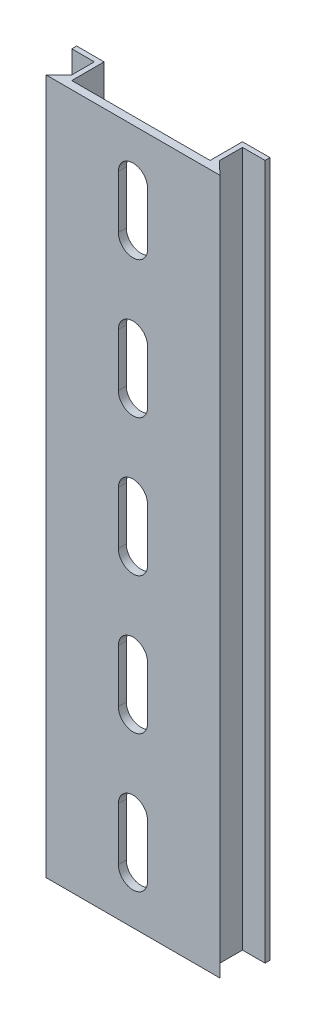
ISO-10303-21;
HEADER;
FILE_DESCRIPTION(('STEP AP214'),'2;1');
FILE_NAME('part.step','',(''),(''),'','','');
FILE_SCHEMA(('AUTOMOTIVE_DESIGN { 1 0 10303 214 1 1 1 1 }'));
ENDSEC;
DATA;
#1=APPLICATION_CONTEXT('core data for automotive mechanical design processes');
#2=APPLICATION_PROTOCOL_DEFINITION('international standard','automotive_design',2000,#1);
#3=PRODUCT_CONTEXT('',#1,'mechanical');
#4=PRODUCT('Part','Part','',(#3));
#5=PRODUCT_RELATED_PRODUCT_CATEGORY('part','',(#4));
#6=PRODUCT_DEFINITION_FORMATION('','',#4);
#7=PRODUCT_DEFINITION_CONTEXT('part definition',#1,'design');
#8=PRODUCT_DEFINITION('design','',#6,#7);
#9=PRODUCT_DEFINITION_SHAPE('','',#8);
#10=(LENGTH_UNIT() NAMED_UNIT(*) SI_UNIT(.MILLI.,.METRE.));
#11=(NAMED_UNIT(*) PLANE_ANGLE_UNIT() SI_UNIT($,.RADIAN.));
#12=(NAMED_UNIT(*) SI_UNIT($,.STERADIAN.) SOLID_ANGLE_UNIT());
#13=UNCERTAINTY_MEASURE_WITH_UNIT(LENGTH_MEASURE(1.E-05),#10,'distance_accuracy_value','');
#14=(GEOMETRIC_REPRESENTATION_CONTEXT(3) GLOBAL_UNCERTAINTY_ASSIGNED_CONTEXT((#13)) GLOBAL_UNIT_ASSIGNED_CONTEXT((#10,
#11,#12)) REPRESENTATION_CONTEXT('',''));
#15=CARTESIAN_POINT('',(0.,0.,0.));
#16=DIRECTION('',(0.,0.,1.));
#17=DIRECTION('',(1.,0.,0.));
#18=AXIS2_PLACEMENT_3D('',#15,#16,#17);
#19=CARTESIAN_POINT('',(0.,63.5,-1.4478));
#20=DIRECTION('',(0.,0.,-1.));
#21=DIRECTION('',(-1.,0.,0.));
#22=AXIS2_PLACEMENT_3D('',#19,#20,#21);
#23=PLANE('',#22);
#24=CARTESIAN_POINT('',(0.,-54.833,-1.4478));
#25=DIRECTION('',(0.,0.,-1.));
#26=DIRECTION('',(-1.,0.,0.));
#27=AXIS2_PLACEMENT_3D('',#24,#25,#26);
#28=CIRCLE('',#27,2.667);
#29=CARTESIAN_POINT('',(2.667,-54.833,-1.4478));
#30=VERTEX_POINT('',#29);
#31=CARTESIAN_POINT('',(-2.667,-54.833,-1.4478));
#32=VERTEX_POINT('',#31);
#33=EDGE_CURVE('E271',#30,#32,#28,.T.);
#34=ORIENTED_EDGE('',*,*,#33,.F.);
#35=DIRECTION('',(0.,-1.,0.));
#36=VECTOR('',#35,1.);
#37=CARTESIAN_POINT('',(2.667,13.5,-1.4478));
#38=LINE('',#37,#36);
#39=CARTESIAN_POINT('',(2.667,-45.167,-1.4478));
#40=VERTEX_POINT('',#39);
#41=EDGE_CURVE('E256',#40,#30,#38,.T.);
#42=ORIENTED_EDGE('',*,*,#41,.F.);
#43=CARTESIAN_POINT('',(0.,-45.167,-1.4478));
#44=DIRECTION('',(0.,0.,-1.));
#45=DIRECTION('',(-1.,0.,0.));
#46=AXIS2_PLACEMENT_3D('',#43,#44,#45);
#47=CIRCLE('',#46,2.667);
#48=CARTESIAN_POINT('',(-2.667,-45.167,-1.4478));
#49=VERTEX_POINT('',#48);
#50=EDGE_CURVE('E49',#49,#40,#47,.T.);
#51=ORIENTED_EDGE('',*,*,#50,.F.);
#52=DIRECTION('',(0.,1.,0.));
#53=VECTOR('',#52,1.);
#54=CARTESIAN_POINT('',(-2.667,13.5,-1.4478));
#55=LINE('',#54,#53);
#56=EDGE_CURVE('E278',#32,#49,#55,.T.);
#57=ORIENTED_EDGE('',*,*,#56,.F.);
#58=EDGE_LOOP('',(#34,#42,#51,#57));
#59=FACE_BOUND('',#58,.T.);
#60=CARTESIAN_POINT('',(0.,20.167,-1.4478));
#61=DIRECTION('',(0.,0.,-1.));
#62=DIRECTION('',(-1.,0.,0.));
#63=AXIS2_PLACEMENT_3D('',#60,#61,#62);
#64=CIRCLE('',#63,2.667);
#65=CARTESIAN_POINT('',(2.667,20.167,-1.4478));
#66=VERTEX_POINT('',#65);
#67=CARTESIAN_POINT('',(-2.667,20.167,-1.4478));
#68=VERTEX_POINT('',#67);
#69=EDGE_CURVE('E311',#66,#68,#64,.T.);
#70=ORIENTED_EDGE('',*,*,#69,.F.);
#71=DIRECTION('',(0.,-1.,0.));
#72=VECTOR('',#71,1.);
#73=CARTESIAN_POINT('',(2.667,88.5,-1.4478));
#74=LINE('',#73,#72);
#75=CARTESIAN_POINT('',(2.667,29.833,-1.4478));
#76=VERTEX_POINT('',#75);
#77=EDGE_CURVE('E287',#76,#66,#74,.T.);
#78=ORIENTED_EDGE('',*,*,#77,.F.);
#79=CARTESIAN_POINT('',(0.,29.833,-1.4478));
#80=DIRECTION('',(0.,0.,-1.));
#81=DIRECTION('',(-1.,0.,0.));
#82=AXIS2_PLACEMENT_3D('',#79,#80,#81);
#83=CIRCLE('',#82,2.667);
#84=CARTESIAN_POINT('',(-2.667,29.833,-1.4478));
#85=VERTEX_POINT('',#84);
#86=EDGE_CURVE('E57',#85,#76,#83,.T.);
#87=ORIENTED_EDGE('',*,*,#86,.F.);
#88=DIRECTION('',(0.,1.,0.));
#89=VECTOR('',#88,1.);
#90=CARTESIAN_POINT('',(-2.667,88.5,-1.4478));
#91=LINE('',#90,#89);
#92=EDGE_CURVE('E303',#68,#85,#91,.T.);
#93=ORIENTED_EDGE('',*,*,#92,.F.);
#94=EDGE_LOOP('',(#70,#78,#87,#93));
#95=FACE_BOUND('',#94,.T.);
#96=CARTESIAN_POINT('',(0.,45.167,-1.4478));
#97=DIRECTION('',(0.,0.,-1.));
#98=DIRECTION('',(-1.,0.,0.));
#99=AXIS2_PLACEMENT_3D('',#96,#97,#98);
#100=CIRCLE('',#99,2.667);
#101=CARTESIAN_POINT('',(2.667,45.167,-1.4478));
#102=VERTEX_POINT('',#101);
#103=CARTESIAN_POINT('',(-2.667,45.167,-1.4478));
#104=VERTEX_POINT('',#103);
#105=EDGE_CURVE('E340',#102,#104,#100,.T.);
#106=ORIENTED_EDGE('',*,*,#105,.F.);
#107=DIRECTION('',(0.,-1.,0.));
#108=VECTOR('',#107,1.);
#109=CARTESIAN_POINT('',(2.667,113.5,-1.4478));
#110=LINE('',#109,#108);
#111=CARTESIAN_POINT('',(2.667,54.833,-1.4478));
#112=VERTEX_POINT('',#111);
#113=EDGE_CURVE('E315',#112,#102,#110,.T.);
#114=ORIENTED_EDGE('',*,*,#113,.F.);
#115=CARTESIAN_POINT('',(0.,54.833,-1.4478));
#116=DIRECTION('',(0.,0.,-1.));
#117=DIRECTION('',(-1.,0.,0.));
#118=AXIS2_PLACEMENT_3D('',#115,#116,#117);
#119=CIRCLE('',#118,2.667);
#120=CARTESIAN_POINT('',(-2.667,54.833,-1.4478));
#121=VERTEX_POINT('',#120);
#122=EDGE_CURVE('E325',#121,#112,#119,.T.);
#123=ORIENTED_EDGE('',*,*,#122,.F.);
#124=DIRECTION('',(0.,1.,0.));
#125=VECTOR('',#124,1.);
#126=CARTESIAN_POINT('',(-2.667,113.5,-1.4478));
#127=LINE('',#126,#125);
#128=EDGE_CURVE('E332',#104,#121,#127,.T.);
#129=ORIENTED_EDGE('',*,*,#128,.F.);
#130=EDGE_LOOP('',(#106,#114,#123,#129));
#131=FACE_BOUND('',#130,.T.);
#132=CARTESIAN_POINT('',(0.,-29.833,-1.4478));
#133=DIRECTION('',(0.,0.,-1.));
#134=DIRECTION('',(-1.,0.,0.));
#135=AXIS2_PLACEMENT_3D('',#132,#133,#134);
#136=CIRCLE('',#135,2.667);
#137=CARTESIAN_POINT('',(2.667,-29.833,-1.4478));
#138=VERTEX_POINT('',#137);
#139=CARTESIAN_POINT('',(-2.667,-29.833,-1.4478));
#140=VERTEX_POINT('',#139);
#141=EDGE_CURVE('E368',#138,#140,#136,.T.);
#142=ORIENTED_EDGE('',*,*,#141,.F.);
#143=DIRECTION('',(0.,-1.,0.));
#144=VECTOR('',#143,1.);
#145=CARTESIAN_POINT('',(2.667,38.5,-1.4478));
#146=LINE('',#145,#144);
#147=CARTESIAN_POINT('',(2.667,-20.167,-1.4478));
#148=VERTEX_POINT('',#147);
#149=EDGE_CURVE('E281',#148,#138,#146,.T.);
#150=ORIENTED_EDGE('',*,*,#149,.F.);
#151=CARTESIAN_POINT('',(0.,-20.167,-1.4478));
#152=DIRECTION('',(0.,0.,-1.));
#153=DIRECTION('',(-1.,0.,0.));
#154=AXIS2_PLACEMENT_3D('',#151,#152,#153);
#155=CIRCLE('',#154,2.667);
#156=CARTESIAN_POINT('',(-2.667,-20.167,-1.4478));
#157=VERTEX_POINT('',#156);
#158=EDGE_CURVE('E353',#157,#148,#155,.T.);
#159=ORIENTED_EDGE('',*,*,#158,.F.);
#160=DIRECTION('',(0.,1.,0.));
#161=VECTOR('',#160,1.);
#162=CARTESIAN_POINT('',(-2.667,38.5,-1.4478));
#163=LINE('',#162,#161);
#164=EDGE_CURVE('E360',#140,#157,#163,.T.);
#165=ORIENTED_EDGE('',*,*,#164,.F.);
#166=EDGE_LOOP('',(#142,#150,#159,#165));
#167=FACE_BOUND('',#166,.T.);
#168=CARTESIAN_POINT('',(0.,-4.833,-1.4478));
#169=DIRECTION('',(0.,0.,-1.));
#170=DIRECTION('',(-1.,0.,0.));
#171=AXIS2_PLACEMENT_3D('',#168,#169,#170);
#172=CIRCLE('',#171,2.667);
#173=CARTESIAN_POINT('',(2.667,-4.833,-1.4478));
#174=VERTEX_POINT('',#173);
#175=CARTESIAN_POINT('',(-2.667,-4.833,-1.4478));
#176=VERTEX_POINT('',#175);
#177=EDGE_CURVE('E400',#174,#176,#172,.T.);
#178=ORIENTED_EDGE('',*,*,#177,.F.);
#179=DIRECTION('',(0.,-1.,0.));
#180=VECTOR('',#179,1.);
#181=CARTESIAN_POINT('',(2.667,63.5,-1.4478));
#182=LINE('',#181,#180);
#183=CARTESIAN_POINT('',(2.667,4.833,-1.4478));
#184=VERTEX_POINT('',#183);
#185=EDGE_CURVE('E387',#184,#174,#182,.T.);
#186=ORIENTED_EDGE('',*,*,#185,.F.);
#187=CARTESIAN_POINT('',(0.,4.833,-1.4478));
#188=DIRECTION('',(0.,0.,-1.));
#189=DIRECTION('',(-1.,0.,0.));
#190=AXIS2_PLACEMENT_3D('',#187,#188,#189);
#191=CIRCLE('',#190,2.667);
#192=CARTESIAN_POINT('',(-2.667,4.833,-1.4478));
#193=VERTEX_POINT('',#192);
#194=EDGE_CURVE('E395',#193,#184,#191,.T.);
#195=ORIENTED_EDGE('',*,*,#194,.F.);
#196=DIRECTION('',(0.,1.,0.));
#197=VECTOR('',#196,1.);
#198=CARTESIAN_POINT('',(-2.667,63.5,-1.4478));
#199=LINE('',#198,#197);
#200=EDGE_CURVE('E398',#176,#193,#199,.T.);
#201=ORIENTED_EDGE('',*,*,#200,.F.);
#202=EDGE_LOOP('',(#178,#186,#195,#201));
#203=FACE_BOUND('',#202,.T.);
#204=DIRECTION('',(1.,0.,0.));
#205=VECTOR('',#204,1.);
#206=CARTESIAN_POINT('',(0.,-63.5,-1.4478));
#207=LINE('',#206,#205);
#208=CARTESIAN_POINT('',(-12.6365,-63.5,-1.4478));
#209=VERTEX_POINT('',#208);
#210=CARTESIAN_POINT('',(12.6365,-63.5,-1.4478));
#211=VERTEX_POINT('',#210);
#212=EDGE_CURVE('E402',#209,#211,#207,.T.);
#213=ORIENTED_EDGE('',*,*,#212,.F.);
#214=DIRECTION('',(0.,-1.,0.));
#215=VECTOR('',#214,1.);
#216=CARTESIAN_POINT('',(-12.6365,63.5,-1.4478));
#217=LINE('',#216,#215);
#218=CARTESIAN_POINT('',(-12.6365,63.5,-1.4478));
#219=VERTEX_POINT('',#218);
#220=EDGE_CURVE('E11',#219,#209,#217,.T.);
#221=ORIENTED_EDGE('',*,*,#220,.F.);
#222=DIRECTION('',(1.,0.,0.));
#223=VECTOR('',#222,1.);
#224=CARTESIAN_POINT('',(0.,63.5,-1.4478));
#225=LINE('',#224,#223);
#226=CARTESIAN_POINT('',(12.6365,63.5,-1.4478));
#227=VERTEX_POINT('',#226);
#228=EDGE_CURVE('E403',#219,#227,#225,.T.);
#229=ORIENTED_EDGE('',*,*,#228,.T.);
#230=DIRECTION('',(0.,-1.,0.));
#231=VECTOR('',#230,1.);
#232=CARTESIAN_POINT('',(12.6365,63.5,-1.4478));
#233=LINE('',#232,#231);
#234=EDGE_CURVE('E440',#227,#211,#233,.T.);
#235=ORIENTED_EDGE('',*,*,#234,.T.);
#236=EDGE_LOOP('',(#213,#221,#229,#235));
#237=FACE_BOUND('',#236,.T.);
#238=ADVANCED_FACE('F35',(#59,#95,#131,#167,#203,#237),#23,.T.);
#239=CARTESIAN_POINT('',(-12.6365,63.5,0.));
#240=DIRECTION('',(-1.,0.,0.));
#241=DIRECTION('',(0.,0.,1.));
#242=AXIS2_PLACEMENT_3D('',#239,#240,#241);
#243=PLANE('',#242);
#244=DIRECTION('',(0.,0.,-1.));
#245=VECTOR('',#244,1.);
#246=CARTESIAN_POINT('',(-12.6365,-63.5,0.));
#247=LINE('',#246,#245);
#248=CARTESIAN_POINT('',(-12.6365,-63.5,-7.366));
#249=VERTEX_POINT('',#248);
#250=EDGE_CURVE('E443',#209,#249,#247,.T.);
#251=ORIENTED_EDGE('',*,*,#250,.T.);
#252=DIRECTION('',(0.,-1.,0.));
#253=VECTOR('',#252,1.);
#254=CARTESIAN_POINT('',(-12.6365,63.5,-7.366));
#255=LINE('',#254,#253);
#256=CARTESIAN_POINT('',(-12.6365,63.5,-7.366));
#257=VERTEX_POINT('',#256);
#258=EDGE_CURVE('E42',#257,#249,#255,.T.);
#259=ORIENTED_EDGE('',*,*,#258,.F.);
#260=DIRECTION('',(0.,0.,-1.));
#261=VECTOR('',#260,1.);
#262=CARTESIAN_POINT('',(-12.6365,63.5,0.));
#263=LINE('',#262,#261);
#264=EDGE_CURVE('E406',#219,#257,#263,.T.);
#265=ORIENTED_EDGE('',*,*,#264,.F.);
#266=ORIENTED_EDGE('',*,*,#220,.T.);
#267=EDGE_LOOP('',(#251,#259,#265,#266));
#268=FACE_BOUND('',#267,.T.);
#269=ADVANCED_FACE('F532',(#268),#243,.F.);
#270=CARTESIAN_POINT('',(0.,63.5,-7.366));
#271=DIRECTION('',(0.,0.,1.));
#272=DIRECTION('',(1.,0.,0.));
#273=AXIS2_PLACEMENT_3D('',#270,#271,#272);
#274=PLANE('',#273);
#275=DIRECTION('',(-1.,0.,0.));
#276=VECTOR('',#275,1.);
#277=CARTESIAN_POINT('',(0.,-63.5,-7.366));
#278=LINE('',#277,#276);
#279=CARTESIAN_POINT('',(-17.653,-63.5,-7.366));
#280=VERTEX_POINT('',#279);
#281=EDGE_CURVE('E445',#249,#280,#278,.T.);
#282=ORIENTED_EDGE('',*,*,#281,.T.);
#283=DIRECTION('',(0.,-1.,0.));
#284=VECTOR('',#283,1.);
#285=CARTESIAN_POINT('',(-17.653,63.5,-7.366));
#286=LINE('',#285,#284);
#287=CARTESIAN_POINT('',(-17.653,63.5,-7.366));
#288=VERTEX_POINT('',#287);
#289=EDGE_CURVE('E500',#288,#280,#286,.T.);
#290=ORIENTED_EDGE('',*,*,#289,.F.);
#291=DIRECTION('',(-1.,0.,0.));
#292=VECTOR('',#291,1.);
#293=CARTESIAN_POINT('',(0.,63.5,-7.366));
#294=LINE('',#293,#292);
#295=EDGE_CURVE('E409',#257,#288,#294,.T.);
#296=ORIENTED_EDGE('',*,*,#295,.F.);
#297=ORIENTED_EDGE('',*,*,#258,.T.);
#298=EDGE_LOOP('',(#282,#290,#296,#297));
#299=FACE_BOUND('',#298,.T.);
#300=ADVANCED_FACE('F507',(#299),#274,.F.);
#301=CARTESIAN_POINT('',(-17.653,63.5,0.));
#302=DIRECTION('',(1.,0.,0.));
#303=DIRECTION('',(0.,0.,-1.));
#304=AXIS2_PLACEMENT_3D('',#301,#302,#303);
#305=PLANE('',#304);
#306=DIRECTION('',(0.,0.,1.));
#307=VECTOR('',#306,1.);
#308=CARTESIAN_POINT('',(-17.653,-63.5,0.));
#309=LINE('',#308,#307);
#310=CARTESIAN_POINT('',(-17.653,-63.5,-6.477));
#311=VERTEX_POINT('',#310);
#312=EDGE_CURVE('E447',#280,#311,#309,.T.);
#313=ORIENTED_EDGE('',*,*,#312,.T.);
#314=DIRECTION('',(0.,-1.,0.));
#315=VECTOR('',#314,1.);
#316=CARTESIAN_POINT('',(-17.653,63.5,-6.477));
#317=LINE('',#316,#315);
#318=CARTESIAN_POINT('',(-17.653,63.5,-6.477));
#319=VERTEX_POINT('',#318);
#320=EDGE_CURVE('E497',#319,#311,#317,.T.);
#321=ORIENTED_EDGE('',*,*,#320,.F.);
#322=DIRECTION('',(0.,0.,1.));
#323=VECTOR('',#322,1.);
#324=CARTESIAN_POINT('',(-17.653,63.5,0.));
#325=LINE('',#324,#323);
#326=EDGE_CURVE('E411',#288,#319,#325,.T.);
#327=ORIENTED_EDGE('',*,*,#326,.F.);
#328=ORIENTED_EDGE('',*,*,#289,.T.);
#329=EDGE_LOOP('',(#313,#321,#327,#328));
#330=FACE_BOUND('',#329,.T.);
#331=ADVANCED_FACE('F520',(#330),#305,.F.);
#332=CARTESIAN_POINT('',(0.,63.5,-6.477));
#333=DIRECTION('',(0.,0.,-1.));
#334=DIRECTION('',(-1.,0.,0.));
#335=AXIS2_PLACEMENT_3D('',#332,#333,#334);
#336=PLANE('',#335);
#337=DIRECTION('',(1.,0.,0.));
#338=VECTOR('',#337,1.);
#339=CARTESIAN_POINT('',(0.,-63.5,-6.477));
#340=LINE('',#339,#338);
#341=CARTESIAN_POINT('',(-13.5255,-63.5,-6.477));
#342=VERTEX_POINT('',#341);
#343=EDGE_CURVE('E449',#311,#342,#340,.T.);
#344=ORIENTED_EDGE('',*,*,#343,.T.);
#345=DIRECTION('',(0.,-1.,0.));
#346=VECTOR('',#345,1.);
#347=CARTESIAN_POINT('',(-13.5255,63.5,-6.477));
#348=LINE('',#347,#346);
#349=CARTESIAN_POINT('',(-13.5255,63.5,-6.477));
#350=VERTEX_POINT('',#349);
#351=EDGE_CURVE('E494',#350,#342,#348,.T.);
#352=ORIENTED_EDGE('',*,*,#351,.F.);
#353=DIRECTION('',(1.,0.,0.));
#354=VECTOR('',#353,1.);
#355=CARTESIAN_POINT('',(0.,63.5,-6.477));
#356=LINE('',#355,#354);
#357=EDGE_CURVE('E413',#319,#350,#356,.T.);
#358=ORIENTED_EDGE('',*,*,#357,.F.);
#359=ORIENTED_EDGE('',*,*,#320,.T.);
#360=EDGE_LOOP('',(#344,#352,#358,#359));
#361=FACE_BOUND('',#360,.T.);
#362=ADVANCED_FACE('F524',(#361),#336,.F.);
#363=CARTESIAN_POINT('',(-13.5255,63.5,0.));
#364=DIRECTION('',(1.,0.,0.));
#365=DIRECTION('',(0.,0.,-1.));
#366=AXIS2_PLACEMENT_3D('',#363,#364,#365);
#367=PLANE('',#366);
#368=DIRECTION('',(0.,0.,1.));
#369=VECTOR('',#368,1.);
#370=CARTESIAN_POINT('',(-13.5255,-63.5,0.));
#371=LINE('',#370,#369);
#372=CARTESIAN_POINT('',(-13.5255,-63.5,-2.286));
#373=VERTEX_POINT('',#372);
#374=EDGE_CURVE('E451',#342,#373,#371,.T.);
#375=ORIENTED_EDGE('',*,*,#374,.T.);
#376=DIRECTION('',(0.,-1.,0.));
#377=VECTOR('',#376,1.);
#378=CARTESIAN_POINT('',(-13.5255,63.5,-2.286));
#379=LINE('',#378,#377);
#380=CARTESIAN_POINT('',(-13.5255,63.5,-2.286));
#381=VERTEX_POINT('',#380);
#382=EDGE_CURVE('E491',#381,#373,#379,.T.);
#383=ORIENTED_EDGE('',*,*,#382,.F.);
#384=DIRECTION('',(0.,0.,1.));
#385=VECTOR('',#384,1.);
#386=CARTESIAN_POINT('',(-13.5255,63.5,0.));
#387=LINE('',#386,#385);
#388=EDGE_CURVE('E415',#350,#381,#387,.T.);
#389=ORIENTED_EDGE('',*,*,#388,.F.);
#390=ORIENTED_EDGE('',*,*,#351,.T.);
#391=EDGE_LOOP('',(#375,#383,#389,#390));
#392=FACE_BOUND('',#391,.T.);
#393=ADVANCED_FACE('F567',(#392),#367,.F.);
#394=CARTESIAN_POINT('',(-7.72007504690431,63.5,-7.93452157598499));
#395=DIRECTION('',(0.697354959803453,0.,0.716725930909105));
#396=DIRECTION('',(0.716725930909106,0.,-0.697354959803454));
#397=AXIS2_PLACEMENT_3D('',#394,#395,#396);
#398=PLANE('',#397);
#399=DIRECTION('',(-0.716725930909106,0.,0.697354959803454));
#400=VECTOR('',#399,1.);
#401=CARTESIAN_POINT('',(-7.72007504690431,-63.5,-7.93452157598499));
#402=LINE('',#401,#400);
#403=CARTESIAN_POINT('',(-15.875,-63.5,0.));
#404=VERTEX_POINT('',#403);
#405=EDGE_CURVE('E453',#373,#404,#402,.T.);
#406=ORIENTED_EDGE('',*,*,#405,.T.);
#407=DIRECTION('',(0.,-1.,0.));
#408=VECTOR('',#407,1.);
#409=CARTESIAN_POINT('',(-15.875,63.5,0.));
#410=LINE('',#409,#408);
#411=CARTESIAN_POINT('',(-15.875,63.5,0.));
#412=VERTEX_POINT('',#411);
#413=EDGE_CURVE('E489',#412,#404,#410,.T.);
#414=ORIENTED_EDGE('',*,*,#413,.F.);
#415=DIRECTION('',(-0.716725930909106,0.,0.697354959803454));
#416=VECTOR('',#415,1.);
#417=CARTESIAN_POINT('',(-7.72007504690431,63.5,-7.93452157598499));
#418=LINE('',#417,#416);
#419=EDGE_CURVE('E417',#381,#412,#418,.T.);
#420=ORIENTED_EDGE('',*,*,#419,.F.);
#421=ORIENTED_EDGE('',*,*,#382,.T.);
#422=EDGE_LOOP('',(#406,#414,#420,#421));
#423=FACE_BOUND('',#422,.T.);
#424=ADVANCED_FACE('F565',(#423),#398,.F.);
#425=CARTESIAN_POINT('',(0.,63.5,0.));
#426=DIRECTION('',(0.,0.,1.));
#427=DIRECTION('',(1.,0.,0.));
#428=AXIS2_PLACEMENT_3D('',#425,#426,#427);
#429=PLANE('',#428);
#430=CARTESIAN_POINT('',(0.,-54.833,0.));
#431=DIRECTION('',(0.,0.,1.));
#432=DIRECTION('',(1.,0.,0.));
#433=AXIS2_PLACEMENT_3D('',#430,#431,#432);
#434=CIRCLE('',#433,2.667);
#435=CARTESIAN_POINT('',(-2.667,-54.833,0.));
#436=VERTEX_POINT('',#435);
#437=CARTESIAN_POINT('',(2.667,-54.833,0.));
#438=VERTEX_POINT('',#437);
#439=EDGE_CURVE('E274',#436,#438,#434,.T.);
#440=ORIENTED_EDGE('',*,*,#439,.F.);
#441=DIRECTION('',(0.,-1.,0.));
#442=VECTOR('',#441,1.);
#443=CARTESIAN_POINT('',(-2.667,-54.833,0.));
#444=LINE('',#443,#442);
#445=CARTESIAN_POINT('',(-2.667,-45.167,0.));
#446=VERTEX_POINT('',#445);
#447=EDGE_CURVE('E283',#446,#436,#444,.T.);
#448=ORIENTED_EDGE('',*,*,#447,.F.);
#449=CARTESIAN_POINT('',(0.,-45.167,0.));
#450=DIRECTION('',(0.,0.,1.));
#451=DIRECTION('',(1.,0.,0.));
#452=AXIS2_PLACEMENT_3D('',#449,#450,#451);
#453=CIRCLE('',#452,2.667);
#454=CARTESIAN_POINT('',(2.667,-45.167,0.));
#455=VERTEX_POINT('',#454);
#456=EDGE_CURVE('E886',#455,#446,#453,.T.);
#457=ORIENTED_EDGE('',*,*,#456,.F.);
#458=DIRECTION('',(0.,1.,0.));
#459=VECTOR('',#458,1.);
#460=CARTESIAN_POINT('',(2.667,-54.833,0.));
#461=LINE('',#460,#459);
#462=EDGE_CURVE('E264',#438,#455,#461,.T.);
#463=ORIENTED_EDGE('',*,*,#462,.F.);
#464=EDGE_LOOP('',(#440,#448,#457,#463));
#465=FACE_BOUND('',#464,.T.);
#466=CARTESIAN_POINT('',(0.,20.167,0.));
#467=DIRECTION('',(0.,0.,1.));
#468=DIRECTION('',(1.,0.,0.));
#469=AXIS2_PLACEMENT_3D('',#466,#467,#468);
#470=CIRCLE('',#469,2.667);
#471=CARTESIAN_POINT('',(-2.667,20.167,0.));
#472=VERTEX_POINT('',#471);
#473=CARTESIAN_POINT('',(2.667,20.167,0.));
#474=VERTEX_POINT('',#473);
#475=EDGE_CURVE('E265',#472,#474,#470,.T.);
#476=ORIENTED_EDGE('',*,*,#475,.F.);
#477=DIRECTION('',(0.,-1.,0.));
#478=VECTOR('',#477,1.);
#479=CARTESIAN_POINT('',(-2.667,20.167,0.));
#480=LINE('',#479,#478);
#481=CARTESIAN_POINT('',(-2.667,29.833,0.));
#482=VERTEX_POINT('',#481);
#483=EDGE_CURVE('E306',#482,#472,#480,.T.);
#484=ORIENTED_EDGE('',*,*,#483,.F.);
#485=CARTESIAN_POINT('',(0.,29.833,0.));
#486=DIRECTION('',(0.,0.,1.));
#487=DIRECTION('',(1.,0.,0.));
#488=AXIS2_PLACEMENT_3D('',#485,#486,#487);
#489=CIRCLE('',#488,2.667);
#490=CARTESIAN_POINT('',(2.667,29.833,0.));
#491=VERTEX_POINT('',#490);
#492=EDGE_CURVE('E298',#491,#482,#489,.T.);
#493=ORIENTED_EDGE('',*,*,#492,.F.);
#494=DIRECTION('',(0.,1.,0.));
#495=VECTOR('',#494,1.);
#496=CARTESIAN_POINT('',(2.667,20.167,0.));
#497=LINE('',#496,#495);
#498=EDGE_CURVE('E289',#474,#491,#497,.T.);
#499=ORIENTED_EDGE('',*,*,#498,.F.);
#500=EDGE_LOOP('',(#476,#484,#493,#499));
#501=FACE_BOUND('',#500,.T.);
#502=CARTESIAN_POINT('',(0.,45.167,0.));
#503=DIRECTION('',(0.,0.,1.));
#504=DIRECTION('',(1.,0.,0.));
#505=AXIS2_PLACEMENT_3D('',#502,#503,#504);
#506=CIRCLE('',#505,2.667);
#507=CARTESIAN_POINT('',(-2.667,45.167,0.));
#508=VERTEX_POINT('',#507);
#509=CARTESIAN_POINT('',(2.667,45.167,0.));
#510=VERTEX_POINT('',#509);
#511=EDGE_CURVE('E290',#508,#510,#506,.T.);
#512=ORIENTED_EDGE('',*,*,#511,.F.);
#513=DIRECTION('',(0.,-1.,0.));
#514=VECTOR('',#513,1.);
#515=CARTESIAN_POINT('',(-2.667,45.167,0.));
#516=LINE('',#515,#514);
#517=CARTESIAN_POINT('',(-2.667,54.833,0.));
#518=VERTEX_POINT('',#517);
#519=EDGE_CURVE('E335',#518,#508,#516,.T.);
#520=ORIENTED_EDGE('',*,*,#519,.F.);
#521=CARTESIAN_POINT('',(0.,54.833,0.));
#522=DIRECTION('',(0.,0.,1.));
#523=DIRECTION('',(1.,0.,0.));
#524=AXIS2_PLACEMENT_3D('',#521,#522,#523);
#525=CIRCLE('',#524,2.667);
#526=CARTESIAN_POINT('',(2.667,54.833,0.));
#527=VERTEX_POINT('',#526);
#528=EDGE_CURVE('E327',#527,#518,#525,.T.);
#529=ORIENTED_EDGE('',*,*,#528,.F.);
#530=DIRECTION('',(0.,1.,0.));
#531=VECTOR('',#530,1.);
#532=CARTESIAN_POINT('',(2.667,45.167,0.));
#533=LINE('',#532,#531);
#534=EDGE_CURVE('E317',#510,#527,#533,.T.);
#535=ORIENTED_EDGE('',*,*,#534,.F.);
#536=EDGE_LOOP('',(#512,#520,#529,#535));
#537=FACE_BOUND('',#536,.T.);
#538=CARTESIAN_POINT('',(0.,-29.833,0.));
#539=DIRECTION('',(0.,0.,1.));
#540=DIRECTION('',(1.,0.,0.));
#541=AXIS2_PLACEMENT_3D('',#538,#539,#540);
#542=CIRCLE('',#541,2.667);
#543=CARTESIAN_POINT('',(-2.667,-29.833,0.));
#544=VERTEX_POINT('',#543);
#545=CARTESIAN_POINT('',(2.667,-29.833,0.));
#546=VERTEX_POINT('',#545);
#547=EDGE_CURVE('E371',#544,#546,#542,.T.);
#548=ORIENTED_EDGE('',*,*,#547,.F.);
#549=DIRECTION('',(0.,-1.,0.));
#550=VECTOR('',#549,1.);
#551=CARTESIAN_POINT('',(-2.667,-29.833,0.));
#552=LINE('',#551,#550);
#553=CARTESIAN_POINT('',(-2.667,-20.167,0.));
#554=VERTEX_POINT('',#553);
#555=EDGE_CURVE('E363',#554,#544,#552,.T.);
#556=ORIENTED_EDGE('',*,*,#555,.F.);
#557=CARTESIAN_POINT('',(0.,-20.167,0.));
#558=DIRECTION('',(0.,0.,1.));
#559=DIRECTION('',(1.,0.,0.));
#560=AXIS2_PLACEMENT_3D('',#557,#558,#559);
#561=CIRCLE('',#560,2.667);
#562=CARTESIAN_POINT('',(2.667,-20.167,0.));
#563=VERTEX_POINT('',#562);
#564=EDGE_CURVE('E355',#563,#554,#561,.T.);
#565=ORIENTED_EDGE('',*,*,#564,.F.);
#566=DIRECTION('',(0.,1.,0.));
#567=VECTOR('',#566,1.);
#568=CARTESIAN_POINT('',(2.667,-29.833,0.));
#569=LINE('',#568,#567);
#570=EDGE_CURVE('E345',#546,#563,#569,.T.);
#571=ORIENTED_EDGE('',*,*,#570,.F.);
#572=EDGE_LOOP('',(#548,#556,#565,#571));
#573=FACE_BOUND('',#572,.T.);
#574=CARTESIAN_POINT('',(0.,-4.833,0.));
#575=DIRECTION('',(0.,0.,1.));
#576=DIRECTION('',(1.,0.,0.));
#577=AXIS2_PLACEMENT_3D('',#574,#575,#576);
#578=CIRCLE('',#577,2.667);
#579=CARTESIAN_POINT('',(-2.667,-4.833,0.));
#580=VERTEX_POINT('',#579);
#581=CARTESIAN_POINT('',(2.667,-4.833,0.));
#582=VERTEX_POINT('',#581);
#583=EDGE_CURVE('E373',#580,#582,#578,.T.);
#584=ORIENTED_EDGE('',*,*,#583,.F.);
#585=DIRECTION('',(0.,-1.,0.));
#586=VECTOR('',#585,1.);
#587=CARTESIAN_POINT('',(-2.667,-4.833,0.));
#588=LINE('',#587,#586);
#589=CARTESIAN_POINT('',(-2.667,4.833,0.));
#590=VERTEX_POINT('',#589);
#591=EDGE_CURVE('E381',#590,#580,#588,.T.);
#592=ORIENTED_EDGE('',*,*,#591,.F.);
#593=CARTESIAN_POINT('',(0.,4.833,0.));
#594=DIRECTION('',(0.,0.,1.));
#595=DIRECTION('',(1.,0.,0.));
#596=AXIS2_PLACEMENT_3D('',#593,#594,#595);
#597=CIRCLE('',#596,2.667);
#598=CARTESIAN_POINT('',(2.667,4.833,0.));
#599=VERTEX_POINT('',#598);
#600=EDGE_CURVE('E378',#599,#590,#597,.T.);
#601=ORIENTED_EDGE('',*,*,#600,.F.);
#602=DIRECTION('',(0.,1.,0.));
#603=VECTOR('',#602,1.);
#604=CARTESIAN_POINT('',(2.667,-4.833,0.));
#605=LINE('',#604,#603);
#606=EDGE_CURVE('E375',#582,#599,#605,.T.);
#607=ORIENTED_EDGE('',*,*,#606,.F.);
#608=EDGE_LOOP('',(#584,#592,#601,#607));
#609=FACE_BOUND('',#608,.T.);
#610=DIRECTION('',(-1.,0.,0.));
#611=VECTOR('',#610,1.);
#612=CARTESIAN_POINT('',(0.,-63.5,0.));
#613=LINE('',#612,#611);
#614=CARTESIAN_POINT('',(15.875,-63.5,0.));
#615=VERTEX_POINT('',#614);
#616=EDGE_CURVE('E456',#615,#404,#613,.T.);
#617=ORIENTED_EDGE('',*,*,#616,.F.);
#618=DIRECTION('',(0.,-1.,0.));
#619=VECTOR('',#618,1.);
#620=CARTESIAN_POINT('',(15.875,63.5,0.));
#621=LINE('',#620,#619);
#622=CARTESIAN_POINT('',(15.875,63.5,0.));
#623=VERTEX_POINT('',#622);
#624=EDGE_CURVE('E487',#623,#615,#621,.T.);
#625=ORIENTED_EDGE('',*,*,#624,.F.);
#626=DIRECTION('',(-1.,0.,0.));
#627=VECTOR('',#626,1.);
#628=CARTESIAN_POINT('',(0.,63.5,0.));
#629=LINE('',#628,#627);
#630=EDGE_CURVE('E419',#623,#412,#629,.T.);
#631=ORIENTED_EDGE('',*,*,#630,.T.);
#632=ORIENTED_EDGE('',*,*,#413,.T.);
#633=EDGE_LOOP('',(#617,#625,#631,#632));
#634=FACE_BOUND('',#633,.T.);
#635=ADVANCED_FACE('F561',(#465,#501,#537,#573,#609,#634),#429,.T.);
#636=CARTESIAN_POINT('',(7.72007504690431,63.5,-7.93452157598499));
#637=DIRECTION('',(0.697354959803453,0.,-0.716725930909105));
#638=DIRECTION('',(-0.716725930909106,0.,-0.697354959803454));
#639=AXIS2_PLACEMENT_3D('',#636,#637,#638);
#640=PLANE('',#639);
#641=DIRECTION('',(0.716725930909106,0.,0.697354959803454));
#642=VECTOR('',#641,1.);
#643=CARTESIAN_POINT('',(7.72007504690431,-63.5,-7.93452157598499));
#644=LINE('',#643,#642);
#645=CARTESIAN_POINT('',(13.5255,-63.5,-2.286));
#646=VERTEX_POINT('',#645);
#647=EDGE_CURVE('E459',#646,#615,#644,.T.);
#648=ORIENTED_EDGE('',*,*,#647,.F.);
#649=DIRECTION('',(0.,-1.,0.));
#650=VECTOR('',#649,1.);
#651=CARTESIAN_POINT('',(13.5255,63.5,-2.286));
#652=LINE('',#651,#650);
#653=CARTESIAN_POINT('',(13.5255,63.5,-2.286));
#654=VERTEX_POINT('',#653);
#655=EDGE_CURVE('E485',#654,#646,#652,.T.);
#656=ORIENTED_EDGE('',*,*,#655,.F.);
#657=DIRECTION('',(0.716725930909106,0.,0.697354959803454));
#658=VECTOR('',#657,1.);
#659=CARTESIAN_POINT('',(7.72007504690431,63.5,-7.93452157598499));
#660=LINE('',#659,#658);
#661=EDGE_CURVE('E422',#654,#623,#660,.T.);
#662=ORIENTED_EDGE('',*,*,#661,.T.);
#663=ORIENTED_EDGE('',*,*,#624,.T.);
#664=EDGE_LOOP('',(#648,#656,#662,#663));
#665=FACE_BOUND('',#664,.T.);
#666=ADVANCED_FACE('F557',(#665),#640,.T.);
#667=CARTESIAN_POINT('',(13.5255,63.5,0.));
#668=DIRECTION('',(1.,0.,0.));
#669=DIRECTION('',(0.,0.,-1.));
#670=AXIS2_PLACEMENT_3D('',#667,#668,#669);
#671=PLANE('',#670);
#672=DIRECTION('',(0.,0.,1.));
#673=VECTOR('',#672,1.);
#674=CARTESIAN_POINT('',(13.5255,-63.5,0.));
#675=LINE('',#674,#673);
#676=CARTESIAN_POINT('',(13.5255,-63.5,-6.477));
#677=VERTEX_POINT('',#676);
#678=EDGE_CURVE('E462',#677,#646,#675,.T.);
#679=ORIENTED_EDGE('',*,*,#678,.F.);
#680=DIRECTION('',(0.,-1.,0.));
#681=VECTOR('',#680,1.);
#682=CARTESIAN_POINT('',(13.5255,63.5,-6.477));
#683=LINE('',#682,#681);
#684=CARTESIAN_POINT('',(13.5255,63.5,-6.477));
#685=VERTEX_POINT('',#684);
#686=EDGE_CURVE('E483',#685,#677,#683,.T.);
#687=ORIENTED_EDGE('',*,*,#686,.F.);
#688=DIRECTION('',(0.,0.,1.));
#689=VECTOR('',#688,1.);
#690=CARTESIAN_POINT('',(13.5255,63.5,0.));
#691=LINE('',#690,#689);
#692=EDGE_CURVE('E425',#685,#654,#691,.T.);
#693=ORIENTED_EDGE('',*,*,#692,.T.);
#694=ORIENTED_EDGE('',*,*,#655,.T.);
#695=EDGE_LOOP('',(#679,#687,#693,#694));
#696=FACE_BOUND('',#695,.T.);
#697=ADVANCED_FACE('F552',(#696),#671,.T.);
#698=CARTESIAN_POINT('',(0.,63.5,-6.477));
#699=DIRECTION('',(0.,0.,1.));
#700=DIRECTION('',(1.,0.,0.));
#701=AXIS2_PLACEMENT_3D('',#698,#699,#700);
#702=PLANE('',#701);
#703=DIRECTION('',(-1.,0.,0.));
#704=VECTOR('',#703,1.);
#705=CARTESIAN_POINT('',(0.,-63.5,-6.477));
#706=LINE('',#705,#704);
#707=CARTESIAN_POINT('',(17.653,-63.5,-6.477));
#708=VERTEX_POINT('',#707);
#709=EDGE_CURVE('E465',#708,#677,#706,.T.);
#710=ORIENTED_EDGE('',*,*,#709,.F.);
#711=DIRECTION('',(0.,-1.,0.));
#712=VECTOR('',#711,1.);
#713=CARTESIAN_POINT('',(17.653,63.5,-6.477));
#714=LINE('',#713,#712);
#715=CARTESIAN_POINT('',(17.653,63.5,-6.477));
#716=VERTEX_POINT('',#715);
#717=EDGE_CURVE('E481',#716,#708,#714,.T.);
#718=ORIENTED_EDGE('',*,*,#717,.F.);
#719=DIRECTION('',(-1.,0.,0.));
#720=VECTOR('',#719,1.);
#721=CARTESIAN_POINT('',(0.,63.5,-6.477));
#722=LINE('',#721,#720);
#723=EDGE_CURVE('E428',#716,#685,#722,.T.);
#724=ORIENTED_EDGE('',*,*,#723,.T.);
#725=ORIENTED_EDGE('',*,*,#686,.T.);
#726=EDGE_LOOP('',(#710,#718,#724,#725));
#727=FACE_BOUND('',#726,.T.);
#728=ADVANCED_FACE('F548',(#727),#702,.T.);
#729=CARTESIAN_POINT('',(17.653,63.5,0.));
#730=DIRECTION('',(1.,0.,0.));
#731=DIRECTION('',(0.,0.,-1.));
#732=AXIS2_PLACEMENT_3D('',#729,#730,#731);
#733=PLANE('',#732);
#734=DIRECTION('',(0.,0.,1.));
#735=VECTOR('',#734,1.);
#736=CARTESIAN_POINT('',(17.653,-63.5,0.));
#737=LINE('',#736,#735);
#738=CARTESIAN_POINT('',(17.653,-63.5,-7.366));
#739=VERTEX_POINT('',#738);
#740=EDGE_CURVE('E468',#739,#708,#737,.T.);
#741=ORIENTED_EDGE('',*,*,#740,.F.);
#742=DIRECTION('',(0.,-1.,0.));
#743=VECTOR('',#742,1.);
#744=CARTESIAN_POINT('',(17.653,63.5,-7.366));
#745=LINE('',#744,#743);
#746=CARTESIAN_POINT('',(17.653,63.5,-7.366));
#747=VERTEX_POINT('',#746);
#748=EDGE_CURVE('E479',#747,#739,#745,.T.);
#749=ORIENTED_EDGE('',*,*,#748,.F.);
#750=DIRECTION('',(0.,0.,1.));
#751=VECTOR('',#750,1.);
#752=CARTESIAN_POINT('',(17.653,63.5,0.));
#753=LINE('',#752,#751);
#754=EDGE_CURVE('E431',#747,#716,#753,.T.);
#755=ORIENTED_EDGE('',*,*,#754,.T.);
#756=ORIENTED_EDGE('',*,*,#717,.T.);
#757=EDGE_LOOP('',(#741,#749,#755,#756));
#758=FACE_BOUND('',#757,.T.);
#759=ADVANCED_FACE('F544',(#758),#733,.T.);
#760=CARTESIAN_POINT('',(0.,63.5,-7.366));
#761=DIRECTION('',(0.,0.,-1.));
#762=DIRECTION('',(-1.,0.,0.));
#763=AXIS2_PLACEMENT_3D('',#760,#761,#762);
#764=PLANE('',#763);
#765=DIRECTION('',(1.,0.,0.));
#766=VECTOR('',#765,1.);
#767=CARTESIAN_POINT('',(0.,-63.5,-7.366));
#768=LINE('',#767,#766);
#769=CARTESIAN_POINT('',(12.6365,-63.5,-7.366));
#770=VERTEX_POINT('',#769);
#771=EDGE_CURVE('E471',#770,#739,#768,.T.);
#772=ORIENTED_EDGE('',*,*,#771,.F.);
#773=DIRECTION('',(0.,-1.,0.));
#774=VECTOR('',#773,1.);
#775=CARTESIAN_POINT('',(12.6365,63.5,-7.366));
#776=LINE('',#775,#774);
#777=CARTESIAN_POINT('',(12.6365,63.5,-7.366));
#778=VERTEX_POINT('',#777);
#779=EDGE_CURVE('E477',#778,#770,#776,.T.);
#780=ORIENTED_EDGE('',*,*,#779,.F.);
#781=DIRECTION('',(1.,0.,0.));
#782=VECTOR('',#781,1.);
#783=CARTESIAN_POINT('',(0.,63.5,-7.366));
#784=LINE('',#783,#782);
#785=EDGE_CURVE('E434',#778,#747,#784,.T.);
#786=ORIENTED_EDGE('',*,*,#785,.T.);
#787=ORIENTED_EDGE('',*,*,#748,.T.);
#788=EDGE_LOOP('',(#772,#780,#786,#787));
#789=FACE_BOUND('',#788,.T.);
#790=ADVANCED_FACE('F540',(#789),#764,.T.);
#791=CARTESIAN_POINT('',(12.6365,63.5,0.));
#792=DIRECTION('',(-1.,0.,0.));
#793=DIRECTION('',(0.,0.,1.));
#794=AXIS2_PLACEMENT_3D('',#791,#792,#793);
#795=PLANE('',#794);
#796=DIRECTION('',(0.,0.,-1.));
#797=VECTOR('',#796,1.);
#798=CARTESIAN_POINT('',(12.6365,-63.5,0.));
#799=LINE('',#798,#797);
#800=EDGE_CURVE('E407',#211,#770,#799,.T.);
#801=ORIENTED_EDGE('',*,*,#800,.F.);
#802=ORIENTED_EDGE('',*,*,#234,.F.);
#803=DIRECTION('',(0.,0.,-1.));
#804=VECTOR('',#803,1.);
#805=CARTESIAN_POINT('',(12.6365,63.5,0.));
#806=LINE('',#805,#804);
#807=EDGE_CURVE('E437',#227,#778,#806,.T.);
#808=ORIENTED_EDGE('',*,*,#807,.T.);
#809=ORIENTED_EDGE('',*,*,#779,.T.);
#810=EDGE_LOOP('',(#801,#802,#808,#809));
#811=FACE_BOUND('',#810,.T.);
#812=ADVANCED_FACE('F536',(#811),#795,.T.);
#813=CARTESIAN_POINT('',(0.,63.5,0.));
#814=DIRECTION('',(0.,1.,0.));
#815=DIRECTION('',(0.,0.,1.));
#816=AXIS2_PLACEMENT_3D('',#813,#814,#815);
#817=PLANE('',#816);
#818=ORIENTED_EDGE('',*,*,#228,.F.);
#819=ORIENTED_EDGE('',*,*,#264,.T.);
#820=ORIENTED_EDGE('',*,*,#295,.T.);
#821=ORIENTED_EDGE('',*,*,#326,.T.);
#822=ORIENTED_EDGE('',*,*,#357,.T.);
#823=ORIENTED_EDGE('',*,*,#388,.T.);
#824=ORIENTED_EDGE('',*,*,#419,.T.);
#825=ORIENTED_EDGE('',*,*,#630,.F.);
#826=ORIENTED_EDGE('',*,*,#661,.F.);
#827=ORIENTED_EDGE('',*,*,#692,.F.);
#828=ORIENTED_EDGE('',*,*,#723,.F.);
#829=ORIENTED_EDGE('',*,*,#754,.F.);
#830=ORIENTED_EDGE('',*,*,#785,.F.);
#831=ORIENTED_EDGE('',*,*,#807,.F.);
#832=EDGE_LOOP('',(#818,#819,#820,#821,#822,#823,#824,#825,#826,#827,#828,#829,#830,#831));
#833=FACE_BOUND('',#832,.T.);
#834=ADVANCED_FACE('F529',(#833),#817,.T.);
#835=CARTESIAN_POINT('',(0.,-63.5,0.));
#836=DIRECTION('',(0.,1.,0.));
#837=DIRECTION('',(0.,0.,1.));
#838=AXIS2_PLACEMENT_3D('',#835,#836,#837);
#839=PLANE('',#838);
#840=ORIENTED_EDGE('',*,*,#212,.T.);
#841=ORIENTED_EDGE('',*,*,#800,.T.);
#842=ORIENTED_EDGE('',*,*,#771,.T.);
#843=ORIENTED_EDGE('',*,*,#740,.T.);
#844=ORIENTED_EDGE('',*,*,#709,.T.);
#845=ORIENTED_EDGE('',*,*,#678,.T.);
#846=ORIENTED_EDGE('',*,*,#647,.T.);
#847=ORIENTED_EDGE('',*,*,#616,.T.);
#848=ORIENTED_EDGE('',*,*,#405,.F.);
#849=ORIENTED_EDGE('',*,*,#374,.F.);
#850=ORIENTED_EDGE('',*,*,#343,.F.);
#851=ORIENTED_EDGE('',*,*,#312,.F.);
#852=ORIENTED_EDGE('',*,*,#281,.F.);
#853=ORIENTED_EDGE('',*,*,#250,.F.);
#854=EDGE_LOOP('',(#840,#841,#842,#843,#844,#845,#846,#847,#848,#849,#850,#851,#852,#853));
#855=FACE_BOUND('',#854,.T.);
#856=ADVANCED_FACE('F514',(#855),#839,.F.);
#857=CARTESIAN_POINT('',(0.,-4.833,-7.366));
#858=DIRECTION('',(0.,0.,1.));
#859=DIRECTION('',(1.,0.,0.));
#860=AXIS2_PLACEMENT_3D('',#857,#858,#859);
#861=CYLINDRICAL_SURFACE('',#860,2.667);
#862=ORIENTED_EDGE('',*,*,#177,.T.);
#863=DIRECTION('',(0.,0.,1.));
#864=VECTOR('',#863,1.);
#865=CARTESIAN_POINT('',(-2.667,-4.833,-7.366));
#866=LINE('',#865,#864);
#867=EDGE_CURVE('E385',#176,#580,#866,.T.);
#868=ORIENTED_EDGE('',*,*,#867,.T.);
#869=ORIENTED_EDGE('',*,*,#583,.T.);
#870=DIRECTION('',(0.,0.,1.));
#871=VECTOR('',#870,1.);
#872=CARTESIAN_POINT('',(2.667,-4.833,-7.366));
#873=LINE('',#872,#871);
#874=EDGE_CURVE('E384',#174,#582,#873,.T.);
#875=ORIENTED_EDGE('',*,*,#874,.F.);
#876=EDGE_LOOP('',(#862,#868,#869,#875));
#877=FACE_BOUND('',#876,.T.);
#878=ADVANCED_FACE('F673',(#877),#861,.F.);
#879=CARTESIAN_POINT('',(-2.667,-4.833,-7.366));
#880=DIRECTION('',(-1.,0.,0.));
#881=DIRECTION('',(0.,0.,1.));
#882=AXIS2_PLACEMENT_3D('',#879,#880,#881);
#883=PLANE('',#882);
#884=ORIENTED_EDGE('',*,*,#200,.T.);
#885=DIRECTION('',(0.,0.,1.));
#886=VECTOR('',#885,1.);
#887=CARTESIAN_POINT('',(-2.667,4.833,-7.366));
#888=LINE('',#887,#886);
#889=EDGE_CURVE('E388',#193,#590,#888,.T.);
#890=ORIENTED_EDGE('',*,*,#889,.T.);
#891=ORIENTED_EDGE('',*,*,#591,.T.);
#892=ORIENTED_EDGE('',*,*,#867,.F.);
#893=EDGE_LOOP('',(#884,#890,#891,#892));
#894=FACE_BOUND('',#893,.T.);
#895=ADVANCED_FACE('F682',(#894),#883,.F.);
#896=CARTESIAN_POINT('',(0.,4.833,-7.366));
#897=DIRECTION('',(0.,0.,1.));
#898=DIRECTION('',(1.,0.,0.));
#899=AXIS2_PLACEMENT_3D('',#896,#897,#898);
#900=CYLINDRICAL_SURFACE('',#899,2.667);
#901=ORIENTED_EDGE('',*,*,#194,.T.);
#902=DIRECTION('',(0.,0.,1.));
#903=VECTOR('',#902,1.);
#904=CARTESIAN_POINT('',(2.667,4.833,-7.366));
#905=LINE('',#904,#903);
#906=EDGE_CURVE('E390',#184,#599,#905,.T.);
#907=ORIENTED_EDGE('',*,*,#906,.T.);
#908=ORIENTED_EDGE('',*,*,#600,.T.);
#909=ORIENTED_EDGE('',*,*,#889,.F.);
#910=EDGE_LOOP('',(#901,#907,#908,#909));
#911=FACE_BOUND('',#910,.T.);
#912=ADVANCED_FACE('F692',(#911),#900,.F.);
#913=CARTESIAN_POINT('',(2.667,-4.833,-7.366));
#914=DIRECTION('',(1.,0.,0.));
#915=DIRECTION('',(0.,0.,-1.));
#916=AXIS2_PLACEMENT_3D('',#913,#914,#915);
#917=PLANE('',#916);
#918=ORIENTED_EDGE('',*,*,#185,.T.);
#919=ORIENTED_EDGE('',*,*,#874,.T.);
#920=ORIENTED_EDGE('',*,*,#606,.T.);
#921=ORIENTED_EDGE('',*,*,#906,.F.);
#922=EDGE_LOOP('',(#918,#919,#920,#921));
#923=FACE_BOUND('',#922,.T.);
#924=ADVANCED_FACE('F702',(#923),#917,.F.);
#925=CARTESIAN_POINT('',(0.,-29.833,-7.366));
#926=DIRECTION('',(0.,0.,1.));
#927=DIRECTION('',(1.,0.,0.));
#928=AXIS2_PLACEMENT_3D('',#925,#926,#927);
#929=CYLINDRICAL_SURFACE('',#928,2.667);
#930=ORIENTED_EDGE('',*,*,#141,.T.);
#931=DIRECTION('',(0.,0.,1.));
#932=VECTOR('',#931,1.);
#933=CARTESIAN_POINT('',(-2.667,-29.833,-7.366));
#934=LINE('',#933,#932);
#935=EDGE_CURVE('E365',#140,#544,#934,.T.);
#936=ORIENTED_EDGE('',*,*,#935,.T.);
#937=ORIENTED_EDGE('',*,*,#547,.T.);
#938=DIRECTION('',(0.,0.,1.));
#939=VECTOR('',#938,1.);
#940=CARTESIAN_POINT('',(2.667,-29.833,-7.366));
#941=LINE('',#940,#939);
#942=EDGE_CURVE('E347',#138,#546,#941,.T.);
#943=ORIENTED_EDGE('',*,*,#942,.F.);
#944=EDGE_LOOP('',(#930,#936,#937,#943));
#945=FACE_BOUND('',#944,.T.);
#946=ADVANCED_FACE('F711',(#945),#929,.F.);
#947=CARTESIAN_POINT('',(-2.667,-29.833,-7.366));
#948=DIRECTION('',(-1.,0.,0.));
#949=DIRECTION('',(0.,0.,1.));
#950=AXIS2_PLACEMENT_3D('',#947,#948,#949);
#951=PLANE('',#950);
#952=ORIENTED_EDGE('',*,*,#164,.T.);
#953=DIRECTION('',(0.,0.,1.));
#954=VECTOR('',#953,1.);
#955=CARTESIAN_POINT('',(-2.667,-20.167,-7.366));
#956=LINE('',#955,#954);
#957=EDGE_CURVE('E357',#157,#554,#956,.T.);
#958=ORIENTED_EDGE('',*,*,#957,.T.);
#959=ORIENTED_EDGE('',*,*,#555,.T.);
#960=ORIENTED_EDGE('',*,*,#935,.F.);
#961=EDGE_LOOP('',(#952,#958,#959,#960));
#962=FACE_BOUND('',#961,.T.);
#963=ADVANCED_FACE('F734',(#962),#951,.F.);
#964=CARTESIAN_POINT('',(0.,-20.167,-7.366));
#965=DIRECTION('',(0.,0.,1.));
#966=DIRECTION('',(1.,0.,0.));
#967=AXIS2_PLACEMENT_3D('',#964,#965,#966);
#968=CYLINDRICAL_SURFACE('',#967,2.667);
#969=ORIENTED_EDGE('',*,*,#158,.T.);
#970=DIRECTION('',(0.,0.,1.));
#971=VECTOR('',#970,1.);
#972=CARTESIAN_POINT('',(2.667,-20.167,-7.366));
#973=LINE('',#972,#971);
#974=EDGE_CURVE('E350',#148,#563,#973,.T.);
#975=ORIENTED_EDGE('',*,*,#974,.T.);
#976=ORIENTED_EDGE('',*,*,#564,.T.);
#977=ORIENTED_EDGE('',*,*,#957,.F.);
#978=EDGE_LOOP('',(#969,#975,#976,#977));
#979=FACE_BOUND('',#978,.T.);
#980=ADVANCED_FACE('F744',(#979),#968,.F.);
#981=CARTESIAN_POINT('',(2.667,-29.833,-7.366));
#982=DIRECTION('',(1.,0.,0.));
#983=DIRECTION('',(0.,0.,-1.));
#984=AXIS2_PLACEMENT_3D('',#981,#982,#983);
#985=PLANE('',#984);
#986=ORIENTED_EDGE('',*,*,#149,.T.);
#987=ORIENTED_EDGE('',*,*,#942,.T.);
#988=ORIENTED_EDGE('',*,*,#570,.T.);
#989=ORIENTED_EDGE('',*,*,#974,.F.);
#990=EDGE_LOOP('',(#986,#987,#988,#989));
#991=FACE_BOUND('',#990,.T.);
#992=ADVANCED_FACE('F754',(#991),#985,.F.);
#993=CARTESIAN_POINT('',(0.,45.167,-7.366));
#994=DIRECTION('',(0.,0.,1.));
#995=DIRECTION('',(1.,0.,0.));
#996=AXIS2_PLACEMENT_3D('',#993,#994,#995);
#997=CYLINDRICAL_SURFACE('',#996,2.667);
#998=ORIENTED_EDGE('',*,*,#105,.T.);
#999=DIRECTION('',(0.,0.,1.));
#1000=VECTOR('',#999,1.);
#1001=CARTESIAN_POINT('',(-2.667,45.167,-7.366));
#1002=LINE('',#1001,#1000);
#1003=EDGE_CURVE('E337',#104,#508,#1002,.T.);
#1004=ORIENTED_EDGE('',*,*,#1003,.T.);
#1005=ORIENTED_EDGE('',*,*,#511,.T.);
#1006=DIRECTION('',(0.,0.,1.));
#1007=VECTOR('',#1006,1.);
#1008=CARTESIAN_POINT('',(2.667,45.167,-7.366));
#1009=LINE('',#1008,#1007);
#1010=EDGE_CURVE('E319',#102,#510,#1009,.T.);
#1011=ORIENTED_EDGE('',*,*,#1010,.F.);
#1012=EDGE_LOOP('',(#998,#1004,#1005,#1011));
#1013=FACE_BOUND('',#1012,.T.);
#1014=ADVANCED_FACE('F764',(#1013),#997,.F.);
#1015=CARTESIAN_POINT('',(-2.667,45.167,-7.366));
#1016=DIRECTION('',(-1.,0.,0.));
#1017=DIRECTION('',(0.,0.,1.));
#1018=AXIS2_PLACEMENT_3D('',#1015,#1016,#1017);
#1019=PLANE('',#1018);
#1020=ORIENTED_EDGE('',*,*,#128,.T.);
#1021=DIRECTION('',(0.,0.,1.));
#1022=VECTOR('',#1021,1.);
#1023=CARTESIAN_POINT('',(-2.667,54.833,-7.366));
#1024=LINE('',#1023,#1022);
#1025=EDGE_CURVE('E329',#121,#518,#1024,.T.);
#1026=ORIENTED_EDGE('',*,*,#1025,.T.);
#1027=ORIENTED_EDGE('',*,*,#519,.T.);
#1028=ORIENTED_EDGE('',*,*,#1003,.F.);
#1029=EDGE_LOOP('',(#1020,#1026,#1027,#1028));
#1030=FACE_BOUND('',#1029,.T.);
#1031=ADVANCED_FACE('F774',(#1030),#1019,.F.);
#1032=CARTESIAN_POINT('',(0.,54.833,-7.366));
#1033=DIRECTION('',(0.,0.,1.));
#1034=DIRECTION('',(1.,0.,0.));
#1035=AXIS2_PLACEMENT_3D('',#1032,#1033,#1034);
#1036=CYLINDRICAL_SURFACE('',#1035,2.667);
#1037=ORIENTED_EDGE('',*,*,#122,.T.);
#1038=DIRECTION('',(0.,0.,1.));
#1039=VECTOR('',#1038,1.);
#1040=CARTESIAN_POINT('',(2.667,54.833,-7.366));
#1041=LINE('',#1040,#1039);
#1042=EDGE_CURVE('E322',#112,#527,#1041,.T.);
#1043=ORIENTED_EDGE('',*,*,#1042,.T.);
#1044=ORIENTED_EDGE('',*,*,#528,.T.);
#1045=ORIENTED_EDGE('',*,*,#1025,.F.);
#1046=EDGE_LOOP('',(#1037,#1043,#1044,#1045));
#1047=FACE_BOUND('',#1046,.T.);
#1048=ADVANCED_FACE('F784',(#1047),#1036,.F.);
#1049=CARTESIAN_POINT('',(2.667,45.167,-7.366));
#1050=DIRECTION('',(1.,0.,0.));
#1051=DIRECTION('',(0.,0.,-1.));
#1052=AXIS2_PLACEMENT_3D('',#1049,#1050,#1051);
#1053=PLANE('',#1052);
#1054=ORIENTED_EDGE('',*,*,#113,.T.);
#1055=ORIENTED_EDGE('',*,*,#1010,.T.);
#1056=ORIENTED_EDGE('',*,*,#534,.T.);
#1057=ORIENTED_EDGE('',*,*,#1042,.F.);
#1058=EDGE_LOOP('',(#1054,#1055,#1056,#1057));
#1059=FACE_BOUND('',#1058,.T.);
#1060=ADVANCED_FACE('F794',(#1059),#1053,.F.);
#1061=CARTESIAN_POINT('',(0.,20.167,-7.366));
#1062=DIRECTION('',(0.,0.,1.));
#1063=DIRECTION('',(1.,0.,0.));
#1064=AXIS2_PLACEMENT_3D('',#1061,#1062,#1063);
#1065=CYLINDRICAL_SURFACE('',#1064,2.667);
#1066=ORIENTED_EDGE('',*,*,#69,.T.);
#1067=DIRECTION('',(0.,0.,1.));
#1068=VECTOR('',#1067,1.);
#1069=CARTESIAN_POINT('',(-2.667,20.167,-7.366));
#1070=LINE('',#1069,#1068);
#1071=EDGE_CURVE('E308',#68,#472,#1070,.T.);
#1072=ORIENTED_EDGE('',*,*,#1071,.T.);
#1073=ORIENTED_EDGE('',*,*,#475,.T.);
#1074=DIRECTION('',(0.,0.,1.));
#1075=VECTOR('',#1074,1.);
#1076=CARTESIAN_POINT('',(2.667,20.167,-7.366));
#1077=LINE('',#1076,#1075);
#1078=EDGE_CURVE('E292',#66,#474,#1077,.T.);
#1079=ORIENTED_EDGE('',*,*,#1078,.F.);
#1080=EDGE_LOOP('',(#1066,#1072,#1073,#1079));
#1081=FACE_BOUND('',#1080,.T.);
#1082=ADVANCED_FACE('F804',(#1081),#1065,.F.);
#1083=CARTESIAN_POINT('',(-2.667,20.167,-7.366));
#1084=DIRECTION('',(-1.,0.,0.));
#1085=DIRECTION('',(0.,0.,1.));
#1086=AXIS2_PLACEMENT_3D('',#1083,#1084,#1085);
#1087=PLANE('',#1086);
#1088=ORIENTED_EDGE('',*,*,#92,.T.);
#1089=DIRECTION('',(0.,0.,1.));
#1090=VECTOR('',#1089,1.);
#1091=CARTESIAN_POINT('',(-2.667,29.833,-7.366));
#1092=LINE('',#1091,#1090);
#1093=EDGE_CURVE('E300',#85,#482,#1092,.T.);
#1094=ORIENTED_EDGE('',*,*,#1093,.T.);
#1095=ORIENTED_EDGE('',*,*,#483,.T.);
#1096=ORIENTED_EDGE('',*,*,#1071,.F.);
#1097=EDGE_LOOP('',(#1088,#1094,#1095,#1096));
#1098=FACE_BOUND('',#1097,.T.);
#1099=ADVANCED_FACE('F814',(#1098),#1087,.F.);
#1100=CARTESIAN_POINT('',(0.,29.833,-7.366));
#1101=DIRECTION('',(0.,0.,1.));
#1102=DIRECTION('',(1.,0.,0.));
#1103=AXIS2_PLACEMENT_3D('',#1100,#1101,#1102);
#1104=CYLINDRICAL_SURFACE('',#1103,2.667);
#1105=ORIENTED_EDGE('',*,*,#86,.T.);
#1106=DIRECTION('',(0.,0.,1.));
#1107=VECTOR('',#1106,1.);
#1108=CARTESIAN_POINT('',(2.667,29.833,-7.366));
#1109=LINE('',#1108,#1107);
#1110=EDGE_CURVE('E295',#76,#491,#1109,.T.);
#1111=ORIENTED_EDGE('',*,*,#1110,.T.);
#1112=ORIENTED_EDGE('',*,*,#492,.T.);
#1113=ORIENTED_EDGE('',*,*,#1093,.F.);
#1114=EDGE_LOOP('',(#1105,#1111,#1112,#1113));
#1115=FACE_BOUND('',#1114,.T.);
#1116=ADVANCED_FACE('F824',(#1115),#1104,.F.);
#1117=CARTESIAN_POINT('',(2.667,20.167,-7.366));
#1118=DIRECTION('',(1.,0.,0.));
#1119=DIRECTION('',(0.,0.,-1.));
#1120=AXIS2_PLACEMENT_3D('',#1117,#1118,#1119);
#1121=PLANE('',#1120);
#1122=ORIENTED_EDGE('',*,*,#77,.T.);
#1123=ORIENTED_EDGE('',*,*,#1078,.T.);
#1124=ORIENTED_EDGE('',*,*,#498,.T.);
#1125=ORIENTED_EDGE('',*,*,#1110,.F.);
#1126=EDGE_LOOP('',(#1122,#1123,#1124,#1125));
#1127=FACE_BOUND('',#1126,.T.);
#1128=ADVANCED_FACE('F834',(#1127),#1121,.F.);
#1129=CARTESIAN_POINT('',(0.,-54.833,-7.366));
#1130=DIRECTION('',(0.,0.,1.));
#1131=DIRECTION('',(1.,0.,0.));
#1132=AXIS2_PLACEMENT_3D('',#1129,#1130,#1131);
#1133=CYLINDRICAL_SURFACE('',#1132,2.667);
#1134=ORIENTED_EDGE('',*,*,#33,.T.);
#1135=DIRECTION('',(0.,0.,1.));
#1136=VECTOR('',#1135,1.);
#1137=CARTESIAN_POINT('',(-2.667,-54.833,-7.366));
#1138=LINE('',#1137,#1136);
#1139=EDGE_CURVE('E279',#32,#436,#1138,.T.);
#1140=ORIENTED_EDGE('',*,*,#1139,.T.);
#1141=ORIENTED_EDGE('',*,*,#439,.T.);
#1142=DIRECTION('',(0.,0.,1.));
#1143=VECTOR('',#1142,1.);
#1144=CARTESIAN_POINT('',(2.667,-54.833,-7.366));
#1145=LINE('',#1144,#1143);
#1146=EDGE_CURVE('E259',#30,#438,#1145,.T.);
#1147=ORIENTED_EDGE('',*,*,#1146,.F.);
#1148=EDGE_LOOP('',(#1134,#1140,#1141,#1147));
#1149=FACE_BOUND('',#1148,.T.);
#1150=ADVANCED_FACE('F269',(#1149),#1133,.F.);
#1151=CARTESIAN_POINT('',(-2.667,-54.833,-7.366));
#1152=DIRECTION('',(-1.,0.,0.));
#1153=DIRECTION('',(0.,0.,1.));
#1154=AXIS2_PLACEMENT_3D('',#1151,#1152,#1153);
#1155=PLANE('',#1154);
#1156=ORIENTED_EDGE('',*,*,#56,.T.);
#1157=DIRECTION('',(0.,0.,1.));
#1158=VECTOR('',#1157,1.);
#1159=CARTESIAN_POINT('',(-2.667,-45.167,-7.366));
#1160=LINE('',#1159,#1158);
#1161=EDGE_CURVE('E883',#49,#446,#1160,.T.);
#1162=ORIENTED_EDGE('',*,*,#1161,.T.);
#1163=ORIENTED_EDGE('',*,*,#447,.T.);
#1164=ORIENTED_EDGE('',*,*,#1139,.F.);
#1165=EDGE_LOOP('',(#1156,#1162,#1163,#1164));
#1166=FACE_BOUND('',#1165,.T.);
#1167=ADVANCED_FACE('F852',(#1166),#1155,.F.);
#1168=CARTESIAN_POINT('',(0.,-45.167,-7.366));
#1169=DIRECTION('',(0.,0.,1.));
#1170=DIRECTION('',(1.,0.,0.));
#1171=AXIS2_PLACEMENT_3D('',#1168,#1169,#1170);
#1172=CYLINDRICAL_SURFACE('',#1171,2.667);
#1173=ORIENTED_EDGE('',*,*,#50,.T.);
#1174=DIRECTION('',(0.,0.,1.));
#1175=VECTOR('',#1174,1.);
#1176=CARTESIAN_POINT('',(2.667,-45.167,-7.366));
#1177=LINE('',#1176,#1175);
#1178=EDGE_CURVE('E261',#40,#455,#1177,.T.);
#1179=ORIENTED_EDGE('',*,*,#1178,.T.);
#1180=ORIENTED_EDGE('',*,*,#456,.T.);
#1181=ORIENTED_EDGE('',*,*,#1161,.F.);
#1182=EDGE_LOOP('',(#1173,#1179,#1180,#1181));
#1183=FACE_BOUND('',#1182,.T.);
#1184=ADVANCED_FACE('F861',(#1183),#1172,.F.);
#1185=CARTESIAN_POINT('',(2.667,-54.833,-7.366));
#1186=DIRECTION('',(1.,0.,0.));
#1187=DIRECTION('',(0.,0.,-1.));
#1188=AXIS2_PLACEMENT_3D('',#1185,#1186,#1187);
#1189=PLANE('',#1188);
#1190=ORIENTED_EDGE('',*,*,#41,.T.);
#1191=ORIENTED_EDGE('',*,*,#1146,.T.);
#1192=ORIENTED_EDGE('',*,*,#462,.T.);
#1193=ORIENTED_EDGE('',*,*,#1178,.F.);
#1194=EDGE_LOOP('',(#1190,#1191,#1192,#1193));
#1195=FACE_BOUND('',#1194,.T.);
#1196=ADVANCED_FACE('F258',(#1195),#1189,.F.);
#1197=CLOSED_SHELL('',(#238,#269,#300,#331,#362,#393,#424,#635,#666,#697,#728,#759,#790,#812,
#834,#856,#878,#895,#912,#924,#946,#963,#980,#992,#1014,#1031,#1048,#1060,#1082,#1099,#1116,
#1128,#1150,#1167,#1184,#1196));
#1198=MANIFOLD_SOLID_BREP('B2',#1197);
#1199=ADVANCED_BREP_SHAPE_REPRESENTATION('',(#18,#1198),#14);
#1200=SHAPE_DEFINITION_REPRESENTATION(#9,#1199);
ENDSEC;
END-ISO-10303-21;
